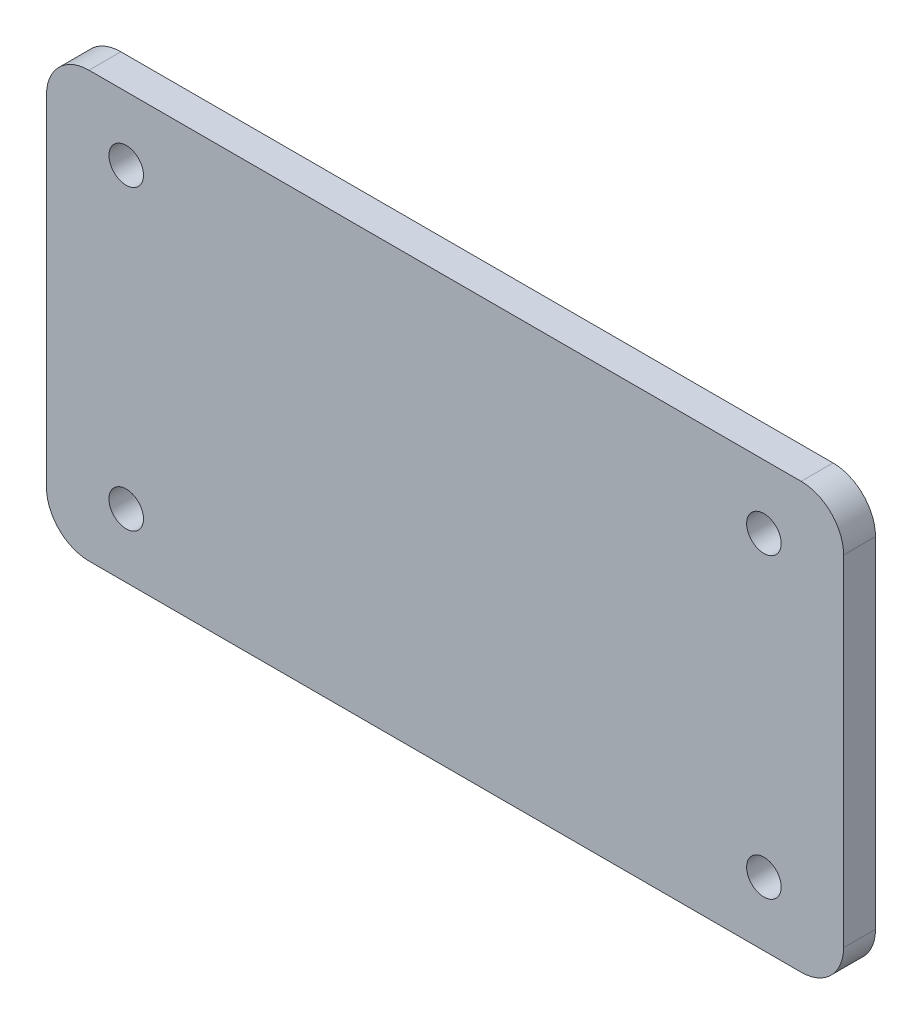
ISO-10303-21;
HEADER;
FILE_DESCRIPTION(('STEP AP214'),'2;1');
FILE_NAME('part.step','',(''),(''),'','','');
FILE_SCHEMA(('AUTOMOTIVE_DESIGN { 1 0 10303 214 1 1 1 1 }'));
ENDSEC;
DATA;
#1=APPLICATION_CONTEXT('core data for automotive mechanical design processes');
#2=APPLICATION_PROTOCOL_DEFINITION('international standard','automotive_design',2000,#1);
#3=PRODUCT_CONTEXT('',#1,'mechanical');
#4=PRODUCT('Part','Part','',(#3));
#5=PRODUCT_RELATED_PRODUCT_CATEGORY('part','',(#4));
#6=PRODUCT_DEFINITION_FORMATION('','',#4);
#7=PRODUCT_DEFINITION_CONTEXT('part definition',#1,'design');
#8=PRODUCT_DEFINITION('design','',#6,#7);
#9=PRODUCT_DEFINITION_SHAPE('','',#8);
#10=(LENGTH_UNIT() NAMED_UNIT(*) SI_UNIT(.MILLI.,.METRE.));
#11=(NAMED_UNIT(*) PLANE_ANGLE_UNIT() SI_UNIT($,.RADIAN.));
#12=(NAMED_UNIT(*) SI_UNIT($,.STERADIAN.) SOLID_ANGLE_UNIT());
#13=UNCERTAINTY_MEASURE_WITH_UNIT(LENGTH_MEASURE(1.E-05),#10,'distance_accuracy_value','');
#14=(GEOMETRIC_REPRESENTATION_CONTEXT(3) GLOBAL_UNCERTAINTY_ASSIGNED_CONTEXT((#13)) GLOBAL_UNIT_ASSIGNED_CONTEXT((#10,
#11,#12)) REPRESENTATION_CONTEXT('',''));
#15=CARTESIAN_POINT('',(0.,0.,0.));
#16=DIRECTION('',(0.,0.,1.));
#17=DIRECTION('',(1.,0.,0.));
#18=AXIS2_PLACEMENT_3D('',#15,#16,#17);
#19=CARTESIAN_POINT('',(75.,-40.,3.));
#20=DIRECTION('',(-1.,0.,0.));
#21=DIRECTION('',(0.,0.,1.));
#22=AXIS2_PLACEMENT_3D('',#19,#20,#21);
#23=PLANE('',#22);
#24=DIRECTION('',(0.,1.,0.));
#25=VECTOR('',#24,1.);
#26=CARTESIAN_POINT('',(75.,-40.,-3.));
#27=LINE('',#26,#25);
#28=CARTESIAN_POINT('',(75.,-32.,-3.));
#29=VERTEX_POINT('',#28);
#30=CARTESIAN_POINT('',(75.,32.,-3.));
#31=VERTEX_POINT('',#30);
#32=EDGE_CURVE('E136',#29,#31,#27,.T.);
#33=ORIENTED_EDGE('',*,*,#32,.T.);
#34=DIRECTION('',(0.,0.,-1.));
#35=VECTOR('',#34,1.);
#36=CARTESIAN_POINT('',(75.,32.,3.));
#37=LINE('',#36,#35);
#38=CARTESIAN_POINT('',(75.,32.,3.));
#39=VERTEX_POINT('',#38);
#40=EDGE_CURVE('E111',#31,#39,#37,.F.);
#41=ORIENTED_EDGE('',*,*,#40,.T.);
#42=DIRECTION('',(0.,1.,0.));
#43=VECTOR('',#42,1.);
#44=CARTESIAN_POINT('',(75.,-40.,3.));
#45=LINE('',#44,#43);
#46=CARTESIAN_POINT('',(75.,-32.,3.));
#47=VERTEX_POINT('',#46);
#48=EDGE_CURVE('E149',#47,#39,#45,.T.);
#49=ORIENTED_EDGE('',*,*,#48,.F.);
#50=DIRECTION('',(0.,0.,-1.));
#51=VECTOR('',#50,1.);
#52=CARTESIAN_POINT('',(75.,-32.,3.));
#53=LINE('',#52,#51);
#54=EDGE_CURVE('E117',#47,#29,#53,.T.);
#55=ORIENTED_EDGE('',*,*,#54,.T.);
#56=EDGE_LOOP('',(#33,#41,#49,#55));
#57=FACE_BOUND('',#56,.T.);
#58=ADVANCED_FACE('F39',(#57),#23,.F.);
#59=CARTESIAN_POINT('',(-75.,40.,3.));
#60=DIRECTION('',(0.,-1.,0.));
#61=DIRECTION('',(0.,0.,-1.));
#62=AXIS2_PLACEMENT_3D('',#59,#60,#61);
#63=PLANE('',#62);
#64=DIRECTION('',(-1.,0.,0.));
#65=VECTOR('',#64,1.);
#66=CARTESIAN_POINT('',(-75.,40.,3.));
#67=LINE('',#66,#65);
#68=CARTESIAN_POINT('',(67.,40.,3.));
#69=VERTEX_POINT('',#68);
#70=CARTESIAN_POINT('',(-67.,40.,3.));
#71=VERTEX_POINT('',#70);
#72=EDGE_CURVE('E127',#69,#71,#67,.T.);
#73=ORIENTED_EDGE('',*,*,#72,.F.);
#74=DIRECTION('',(0.,0.,-1.));
#75=VECTOR('',#74,1.);
#76=CARTESIAN_POINT('',(67.,40.,3.));
#77=LINE('',#76,#75);
#78=CARTESIAN_POINT('',(67.,40.,-3.));
#79=VERTEX_POINT('',#78);
#80=EDGE_CURVE('E110',#69,#79,#77,.T.);
#81=ORIENTED_EDGE('',*,*,#80,.T.);
#82=DIRECTION('',(-1.,0.,0.));
#83=VECTOR('',#82,1.);
#84=CARTESIAN_POINT('',(-75.,40.,-3.));
#85=LINE('',#84,#83);
#86=CARTESIAN_POINT('',(-67.,40.,-3.));
#87=VERTEX_POINT('',#86);
#88=EDGE_CURVE('E124',#79,#87,#85,.T.);
#89=ORIENTED_EDGE('',*,*,#88,.T.);
#90=DIRECTION('',(0.,0.,-1.));
#91=VECTOR('',#90,1.);
#92=CARTESIAN_POINT('',(-67.,40.,3.));
#93=LINE('',#92,#91);
#94=EDGE_CURVE('E130',#87,#71,#93,.F.);
#95=ORIENTED_EDGE('',*,*,#94,.T.);
#96=EDGE_LOOP('',(#73,#81,#89,#95));
#97=FACE_BOUND('',#96,.T.);
#98=ADVANCED_FACE('F123',(#97),#63,.F.);
#99=CARTESIAN_POINT('',(-75.,-40.,3.));
#100=DIRECTION('',(1.,0.,0.));
#101=DIRECTION('',(0.,0.,-1.));
#102=AXIS2_PLACEMENT_3D('',#99,#100,#101);
#103=PLANE('',#102);
#104=DIRECTION('',(0.,-1.,0.));
#105=VECTOR('',#104,1.);
#106=CARTESIAN_POINT('',(-75.,-40.,-3.));
#107=LINE('',#106,#105);
#108=CARTESIAN_POINT('',(-75.,32.,-3.));
#109=VERTEX_POINT('',#108);
#110=CARTESIAN_POINT('',(-75.,-32.,-3.));
#111=VERTEX_POINT('',#110);
#112=EDGE_CURVE('E135',#109,#111,#107,.T.);
#113=ORIENTED_EDGE('',*,*,#112,.T.);
#114=DIRECTION('',(0.,0.,-1.));
#115=VECTOR('',#114,1.);
#116=CARTESIAN_POINT('',(-75.,-32.,3.));
#117=LINE('',#116,#115);
#118=CARTESIAN_POINT('',(-75.,-32.,3.));
#119=VERTEX_POINT('',#118);
#120=EDGE_CURVE('E11',#111,#119,#117,.F.);
#121=ORIENTED_EDGE('',*,*,#120,.T.);
#122=DIRECTION('',(0.,-1.,0.));
#123=VECTOR('',#122,1.);
#124=CARTESIAN_POINT('',(-75.,-40.,3.));
#125=LINE('',#124,#123);
#126=CARTESIAN_POINT('',(-75.,32.,3.));
#127=VERTEX_POINT('',#126);
#128=EDGE_CURVE('E188',#127,#119,#125,.T.);
#129=ORIENTED_EDGE('',*,*,#128,.F.);
#130=DIRECTION('',(0.,0.,-1.));
#131=VECTOR('',#130,1.);
#132=CARTESIAN_POINT('',(-75.,32.,3.));
#133=LINE('',#132,#131);
#134=EDGE_CURVE('E48',#127,#109,#133,.T.);
#135=ORIENTED_EDGE('',*,*,#134,.T.);
#136=EDGE_LOOP('',(#113,#121,#129,#135));
#137=FACE_BOUND('',#136,.T.);
#138=ADVANCED_FACE('F186',(#137),#103,.F.);
#139=CARTESIAN_POINT('',(-75.,-40.,3.));
#140=DIRECTION('',(0.,1.,0.));
#141=DIRECTION('',(0.,0.,1.));
#142=AXIS2_PLACEMENT_3D('',#139,#140,#141);
#143=PLANE('',#142);
#144=DIRECTION('',(1.,0.,0.));
#145=VECTOR('',#144,1.);
#146=CARTESIAN_POINT('',(-75.,-40.,-3.));
#147=LINE('',#146,#145);
#148=CARTESIAN_POINT('',(-67.,-40.,-3.));
#149=VERTEX_POINT('',#148);
#150=CARTESIAN_POINT('',(67.,-40.,-3.));
#151=VERTEX_POINT('',#150);
#152=EDGE_CURVE('E141',#149,#151,#147,.T.);
#153=ORIENTED_EDGE('',*,*,#152,.T.);
#154=DIRECTION('',(0.,0.,-1.));
#155=VECTOR('',#154,1.);
#156=CARTESIAN_POINT('',(67.,-40.,3.));
#157=LINE('',#156,#155);
#158=CARTESIAN_POINT('',(67.,-40.,3.));
#159=VERTEX_POINT('',#158);
#160=EDGE_CURVE('E55',#151,#159,#157,.F.);
#161=ORIENTED_EDGE('',*,*,#160,.T.);
#162=DIRECTION('',(1.,0.,0.));
#163=VECTOR('',#162,1.);
#164=CARTESIAN_POINT('',(-75.,-40.,3.));
#165=LINE('',#164,#163);
#166=CARTESIAN_POINT('',(-67.,-40.,3.));
#167=VERTEX_POINT('',#166);
#168=EDGE_CURVE('E151',#167,#159,#165,.T.);
#169=ORIENTED_EDGE('',*,*,#168,.F.);
#170=DIRECTION('',(0.,0.,-1.));
#171=VECTOR('',#170,1.);
#172=CARTESIAN_POINT('',(-67.,-40.,3.));
#173=LINE('',#172,#171);
#174=EDGE_CURVE('E176',#167,#149,#173,.T.);
#175=ORIENTED_EDGE('',*,*,#174,.T.);
#176=EDGE_LOOP('',(#153,#161,#169,#175));
#177=FACE_BOUND('',#176,.T.);
#178=ADVANCED_FACE('F195',(#177),#143,.F.);
#179=CARTESIAN_POINT('',(0.,0.,3.));
#180=DIRECTION('',(0.,0.,-1.));
#181=DIRECTION('',(-1.,0.,0.));
#182=AXIS2_PLACEMENT_3D('',#179,#180,#181);
#183=PLANE('',#182);
#184=CARTESIAN_POINT('',(60.,28.,3.));
#185=DIRECTION('',(0.,0.,-1.));
#186=DIRECTION('',(-1.,0.,0.));
#187=AXIS2_PLACEMENT_3D('',#184,#185,#186);
#188=CIRCLE('',#187,3.25000000000001);
#189=CARTESIAN_POINT('',(56.75,28.,3.));
#190=VERTEX_POINT('',#189);
#191=EDGE_CURVE('E143',#190,#190,#188,.T.);
#192=ORIENTED_EDGE('',*,*,#191,.T.);
#193=EDGE_LOOP('',(#192));
#194=FACE_BOUND('',#193,.T.);
#195=CARTESIAN_POINT('',(60.,-28.,3.));
#196=DIRECTION('',(0.,0.,-1.));
#197=DIRECTION('',(-1.,0.,0.));
#198=AXIS2_PLACEMENT_3D('',#195,#196,#197);
#199=CIRCLE('',#198,3.25000000000001);
#200=CARTESIAN_POINT('',(56.75,-28.,3.));
#201=VERTEX_POINT('',#200);
#202=EDGE_CURVE('E209',#201,#201,#199,.T.);
#203=ORIENTED_EDGE('',*,*,#202,.T.);
#204=EDGE_LOOP('',(#203));
#205=FACE_BOUND('',#204,.T.);
#206=CARTESIAN_POINT('',(-60.,-28.,3.));
#207=DIRECTION('',(0.,0.,-1.));
#208=DIRECTION('',(-1.,0.,0.));
#209=AXIS2_PLACEMENT_3D('',#206,#207,#208);
#210=CIRCLE('',#209,3.25);
#211=CARTESIAN_POINT('',(-63.25,-28.,3.));
#212=VERTEX_POINT('',#211);
#213=EDGE_CURVE('E213',#212,#212,#210,.T.);
#214=ORIENTED_EDGE('',*,*,#213,.T.);
#215=EDGE_LOOP('',(#214));
#216=FACE_BOUND('',#215,.T.);
#217=CARTESIAN_POINT('',(-60.,28.,3.));
#218=DIRECTION('',(0.,0.,-1.));
#219=DIRECTION('',(-1.,0.,0.));
#220=AXIS2_PLACEMENT_3D('',#217,#218,#219);
#221=CIRCLE('',#220,3.25);
#222=CARTESIAN_POINT('',(-63.25,28.,3.));
#223=VERTEX_POINT('',#222);
#224=EDGE_CURVE('E217',#223,#223,#221,.T.);
#225=ORIENTED_EDGE('',*,*,#224,.T.);
#226=EDGE_LOOP('',(#225));
#227=FACE_BOUND('',#226,.T.);
#228=ORIENTED_EDGE('',*,*,#48,.T.);
#229=CARTESIAN_POINT('',(67.,32.,3.));
#230=DIRECTION('',(0.,0.,-1.));
#231=DIRECTION('',(-1.,0.,0.));
#232=AXIS2_PLACEMENT_3D('',#229,#230,#231);
#233=CIRCLE('',#232,8.);
#234=EDGE_CURVE('E173',#39,#69,#233,.F.);
#235=ORIENTED_EDGE('',*,*,#234,.T.);
#236=ORIENTED_EDGE('',*,*,#72,.T.);
#237=CARTESIAN_POINT('',(-67.,32.,3.));
#238=DIRECTION('',(0.,0.,-1.));
#239=DIRECTION('',(-1.,0.,0.));
#240=AXIS2_PLACEMENT_3D('',#237,#238,#239);
#241=CIRCLE('',#240,8.);
#242=EDGE_CURVE('E165',#71,#127,#241,.F.);
#243=ORIENTED_EDGE('',*,*,#242,.T.);
#244=ORIENTED_EDGE('',*,*,#128,.T.);
#245=CARTESIAN_POINT('',(-67.,-32.,3.));
#246=DIRECTION('',(0.,0.,-1.));
#247=DIRECTION('',(-1.,0.,0.));
#248=AXIS2_PLACEMENT_3D('',#245,#246,#247);
#249=CIRCLE('',#248,8.);
#250=EDGE_CURVE('E62',#119,#167,#249,.F.);
#251=ORIENTED_EDGE('',*,*,#250,.T.);
#252=ORIENTED_EDGE('',*,*,#168,.T.);
#253=CARTESIAN_POINT('',(67.,-32.,3.));
#254=DIRECTION('',(0.,0.,-1.));
#255=DIRECTION('',(-1.,0.,0.));
#256=AXIS2_PLACEMENT_3D('',#253,#254,#255);
#257=CIRCLE('',#256,8.);
#258=EDGE_CURVE('E170',#159,#47,#257,.F.);
#259=ORIENTED_EDGE('',*,*,#258,.T.);
#260=EDGE_LOOP('',(#228,#235,#236,#243,#244,#251,#252,#259));
#261=FACE_BOUND('',#260,.T.);
#262=ADVANCED_FACE('F248',(#194,#205,#216,#227,#261),#183,.F.);
#263=CARTESIAN_POINT('',(0.,0.,-3.));
#264=DIRECTION('',(0.,0.,-1.));
#265=DIRECTION('',(-1.,0.,0.));
#266=AXIS2_PLACEMENT_3D('',#263,#264,#265);
#267=PLANE('',#266);
#268=CARTESIAN_POINT('',(60.,28.,-3.));
#269=DIRECTION('',(0.,0.,1.));
#270=DIRECTION('',(1.,0.,0.));
#271=AXIS2_PLACEMENT_3D('',#268,#269,#270);
#272=CIRCLE('',#271,3.25000000000001);
#273=CARTESIAN_POINT('',(63.25,28.,-3.));
#274=VERTEX_POINT('',#273);
#275=EDGE_CURVE('E226',#274,#274,#272,.T.);
#276=ORIENTED_EDGE('',*,*,#275,.T.);
#277=EDGE_LOOP('',(#276));
#278=FACE_BOUND('',#277,.T.);
#279=CARTESIAN_POINT('',(60.,-28.,-3.));
#280=DIRECTION('',(0.,0.,1.));
#281=DIRECTION('',(1.,0.,0.));
#282=AXIS2_PLACEMENT_3D('',#279,#280,#281);
#283=CIRCLE('',#282,3.25000000000001);
#284=CARTESIAN_POINT('',(63.25,-28.,-3.));
#285=VERTEX_POINT('',#284);
#286=EDGE_CURVE('E230',#285,#285,#283,.T.);
#287=ORIENTED_EDGE('',*,*,#286,.T.);
#288=EDGE_LOOP('',(#287));
#289=FACE_BOUND('',#288,.T.);
#290=CARTESIAN_POINT('',(-60.,-28.,-3.));
#291=DIRECTION('',(0.,0.,1.));
#292=DIRECTION('',(1.,0.,0.));
#293=AXIS2_PLACEMENT_3D('',#290,#291,#292);
#294=CIRCLE('',#293,3.25);
#295=CARTESIAN_POINT('',(-56.75,-28.,-3.));
#296=VERTEX_POINT('',#295);
#297=EDGE_CURVE('E225',#296,#296,#294,.T.);
#298=ORIENTED_EDGE('',*,*,#297,.T.);
#299=EDGE_LOOP('',(#298));
#300=FACE_BOUND('',#299,.T.);
#301=CARTESIAN_POINT('',(-60.,28.,-3.));
#302=DIRECTION('',(0.,0.,1.));
#303=DIRECTION('',(1.,0.,0.));
#304=AXIS2_PLACEMENT_3D('',#301,#302,#303);
#305=CIRCLE('',#304,3.25);
#306=CARTESIAN_POINT('',(-56.75,28.,-3.));
#307=VERTEX_POINT('',#306);
#308=EDGE_CURVE('E221',#307,#307,#305,.T.);
#309=ORIENTED_EDGE('',*,*,#308,.T.);
#310=EDGE_LOOP('',(#309));
#311=FACE_BOUND('',#310,.T.);
#312=ORIENTED_EDGE('',*,*,#88,.F.);
#313=CARTESIAN_POINT('',(67.,32.,-3.));
#314=DIRECTION('',(0.,0.,-1.));
#315=DIRECTION('',(-1.,0.,0.));
#316=AXIS2_PLACEMENT_3D('',#313,#314,#315);
#317=CIRCLE('',#316,8.);
#318=EDGE_CURVE('E106',#79,#31,#317,.T.);
#319=ORIENTED_EDGE('',*,*,#318,.T.);
#320=ORIENTED_EDGE('',*,*,#32,.F.);
#321=CARTESIAN_POINT('',(67.,-32.,-3.));
#322=DIRECTION('',(0.,0.,-1.));
#323=DIRECTION('',(-1.,0.,0.));
#324=AXIS2_PLACEMENT_3D('',#321,#322,#323);
#325=CIRCLE('',#324,8.);
#326=EDGE_CURVE('E118',#29,#151,#325,.T.);
#327=ORIENTED_EDGE('',*,*,#326,.T.);
#328=ORIENTED_EDGE('',*,*,#152,.F.);
#329=CARTESIAN_POINT('',(-67.,-32.,-3.));
#330=DIRECTION('',(0.,0.,-1.));
#331=DIRECTION('',(-1.,0.,0.));
#332=AXIS2_PLACEMENT_3D('',#329,#330,#331);
#333=CIRCLE('',#332,8.);
#334=EDGE_CURVE('E155',#149,#111,#333,.T.);
#335=ORIENTED_EDGE('',*,*,#334,.T.);
#336=ORIENTED_EDGE('',*,*,#112,.F.);
#337=CARTESIAN_POINT('',(-67.,32.,-3.));
#338=DIRECTION('',(0.,0.,-1.));
#339=DIRECTION('',(-1.,0.,0.));
#340=AXIS2_PLACEMENT_3D('',#337,#338,#339);
#341=CIRCLE('',#340,8.);
#342=EDGE_CURVE('E129',#109,#87,#341,.T.);
#343=ORIENTED_EDGE('',*,*,#342,.T.);
#344=EDGE_LOOP('',(#312,#319,#320,#327,#328,#335,#336,#343));
#345=FACE_BOUND('',#344,.T.);
#346=ADVANCED_FACE('F132',(#278,#289,#300,#311,#345),#267,.T.);
#347=CARTESIAN_POINT('',(-60.,28.,-3.));
#348=DIRECTION('',(0.,0.,1.));
#349=DIRECTION('',(1.,0.,0.));
#350=AXIS2_PLACEMENT_3D('',#347,#348,#349);
#351=CYLINDRICAL_SURFACE('',#350,3.25);
#352=ORIENTED_EDGE('',*,*,#308,.F.);
#353=EDGE_LOOP('',(#352));
#354=FACE_BOUND('',#353,.T.);
#355=ORIENTED_EDGE('',*,*,#224,.F.);
#356=EDGE_LOOP('',(#355));
#357=FACE_BOUND('',#356,.T.);
#358=ADVANCED_FACE('F244',(#354,#357),#351,.F.);
#359=CARTESIAN_POINT('',(-60.,-28.,-3.));
#360=DIRECTION('',(0.,0.,1.));
#361=DIRECTION('',(1.,0.,0.));
#362=AXIS2_PLACEMENT_3D('',#359,#360,#361);
#363=CYLINDRICAL_SURFACE('',#362,3.25);
#364=ORIENTED_EDGE('',*,*,#297,.F.);
#365=EDGE_LOOP('',(#364));
#366=FACE_BOUND('',#365,.T.);
#367=ORIENTED_EDGE('',*,*,#213,.F.);
#368=EDGE_LOOP('',(#367));
#369=FACE_BOUND('',#368,.T.);
#370=ADVANCED_FACE('F240',(#366,#369),#363,.F.);
#371=CARTESIAN_POINT('',(60.,-28.,-3.));
#372=DIRECTION('',(0.,0.,1.));
#373=DIRECTION('',(1.,0.,0.));
#374=AXIS2_PLACEMENT_3D('',#371,#372,#373);
#375=CYLINDRICAL_SURFACE('',#374,3.25000000000001);
#376=ORIENTED_EDGE('',*,*,#286,.F.);
#377=EDGE_LOOP('',(#376));
#378=FACE_BOUND('',#377,.T.);
#379=ORIENTED_EDGE('',*,*,#202,.F.);
#380=EDGE_LOOP('',(#379));
#381=FACE_BOUND('',#380,.T.);
#382=ADVANCED_FACE('F243',(#378,#381),#375,.F.);
#383=CARTESIAN_POINT('',(60.,28.,-3.));
#384=DIRECTION('',(0.,0.,1.));
#385=DIRECTION('',(1.,0.,0.));
#386=AXIS2_PLACEMENT_3D('',#383,#384,#385);
#387=CYLINDRICAL_SURFACE('',#386,3.25000000000001);
#388=ORIENTED_EDGE('',*,*,#275,.F.);
#389=EDGE_LOOP('',(#388));
#390=FACE_BOUND('',#389,.T.);
#391=ORIENTED_EDGE('',*,*,#191,.F.);
#392=EDGE_LOOP('',(#391));
#393=FACE_BOUND('',#392,.T.);
#394=ADVANCED_FACE('F265',(#390,#393),#387,.F.);
#395=CARTESIAN_POINT('',(67.,32.,3.));
#396=DIRECTION('',(0.,0.,-1.));
#397=DIRECTION('',(-1.,0.,0.));
#398=AXIS2_PLACEMENT_3D('',#395,#396,#397);
#399=CYLINDRICAL_SURFACE('',#398,8.);
#400=ORIENTED_EDGE('',*,*,#234,.F.);
#401=ORIENTED_EDGE('',*,*,#40,.F.);
#402=ORIENTED_EDGE('',*,*,#318,.F.);
#403=ORIENTED_EDGE('',*,*,#80,.F.);
#404=EDGE_LOOP('',(#400,#401,#402,#403));
#405=FACE_BOUND('',#404,.T.);
#406=ADVANCED_FACE('F109',(#405),#399,.T.);
#407=CARTESIAN_POINT('',(67.,-32.,3.));
#408=DIRECTION('',(0.,0.,-1.));
#409=DIRECTION('',(-1.,0.,0.));
#410=AXIS2_PLACEMENT_3D('',#407,#408,#409);
#411=CYLINDRICAL_SURFACE('',#410,8.);
#412=ORIENTED_EDGE('',*,*,#258,.F.);
#413=ORIENTED_EDGE('',*,*,#160,.F.);
#414=ORIENTED_EDGE('',*,*,#326,.F.);
#415=ORIENTED_EDGE('',*,*,#54,.F.);
#416=EDGE_LOOP('',(#412,#413,#414,#415));
#417=FACE_BOUND('',#416,.T.);
#418=ADVANCED_FACE('F258',(#417),#411,.T.);
#419=CARTESIAN_POINT('',(-67.,-32.,3.));
#420=DIRECTION('',(0.,0.,-1.));
#421=DIRECTION('',(-1.,0.,0.));
#422=AXIS2_PLACEMENT_3D('',#419,#420,#421);
#423=CYLINDRICAL_SURFACE('',#422,8.);
#424=ORIENTED_EDGE('',*,*,#250,.F.);
#425=ORIENTED_EDGE('',*,*,#120,.F.);
#426=ORIENTED_EDGE('',*,*,#334,.F.);
#427=ORIENTED_EDGE('',*,*,#174,.F.);
#428=EDGE_LOOP('',(#424,#425,#426,#427));
#429=FACE_BOUND('',#428,.T.);
#430=ADVANCED_FACE('F194',(#429),#423,.T.);
#431=CARTESIAN_POINT('',(-67.,32.,3.));
#432=DIRECTION('',(0.,0.,-1.));
#433=DIRECTION('',(-1.,0.,0.));
#434=AXIS2_PLACEMENT_3D('',#431,#432,#433);
#435=CYLINDRICAL_SURFACE('',#434,8.);
#436=ORIENTED_EDGE('',*,*,#242,.F.);
#437=ORIENTED_EDGE('',*,*,#94,.F.);
#438=ORIENTED_EDGE('',*,*,#342,.F.);
#439=ORIENTED_EDGE('',*,*,#134,.F.);
#440=EDGE_LOOP('',(#436,#437,#438,#439));
#441=FACE_BOUND('',#440,.T.);
#442=ADVANCED_FACE('F41',(#441),#435,.T.);
#443=CLOSED_SHELL('',(#58,#98,#138,#178,#262,#346,#358,#370,#382,#394,#406,#418,#430,#442));
#444=MANIFOLD_SOLID_BREP('B2',#443);
#445=ADVANCED_BREP_SHAPE_REPRESENTATION('',(#18,#444),#14);
#446=SHAPE_DEFINITION_REPRESENTATION(#9,#445);
ENDSEC;
END-ISO-10303-21;
